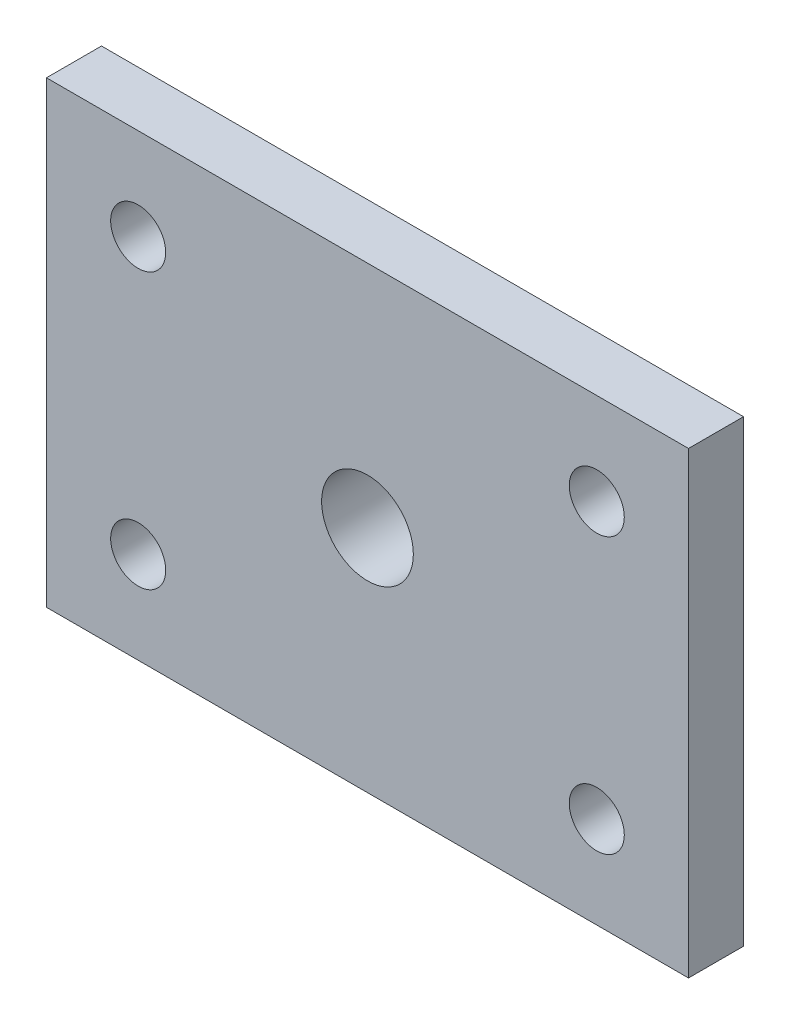
ISO-10303-21;
HEADER;
FILE_DESCRIPTION(('STEP AP214'),'2;1');
FILE_NAME('part.step','',(''),(''),'','','');
FILE_SCHEMA(('AUTOMOTIVE_DESIGN { 1 0 10303 214 1 1 1 1 }'));
ENDSEC;
DATA;
#1=APPLICATION_CONTEXT('core data for automotive mechanical design processes');
#2=APPLICATION_PROTOCOL_DEFINITION('international standard','automotive_design',2000,#1);
#3=PRODUCT_CONTEXT('',#1,'mechanical');
#4=PRODUCT('Part','Part','',(#3));
#5=PRODUCT_RELATED_PRODUCT_CATEGORY('part','',(#4));
#6=PRODUCT_DEFINITION_FORMATION('','',#4);
#7=PRODUCT_DEFINITION_CONTEXT('part definition',#1,'design');
#8=PRODUCT_DEFINITION('design','',#6,#7);
#9=PRODUCT_DEFINITION_SHAPE('','',#8);
#10=(LENGTH_UNIT() NAMED_UNIT(*) SI_UNIT(.MILLI.,.METRE.));
#11=(NAMED_UNIT(*) PLANE_ANGLE_UNIT() SI_UNIT($,.RADIAN.));
#12=(NAMED_UNIT(*) SI_UNIT($,.STERADIAN.) SOLID_ANGLE_UNIT());
#13=UNCERTAINTY_MEASURE_WITH_UNIT(LENGTH_MEASURE(1.E-05),#10,'distance_accuracy_value','');
#14=(GEOMETRIC_REPRESENTATION_CONTEXT(3) GLOBAL_UNCERTAINTY_ASSIGNED_CONTEXT((#13)) GLOBAL_UNIT_ASSIGNED_CONTEXT((#10,
#11,#12)) REPRESENTATION_CONTEXT('',''));
#15=CARTESIAN_POINT('',(0.,0.,0.));
#16=DIRECTION('',(0.,0.,1.));
#17=DIRECTION('',(1.,0.,0.));
#18=AXIS2_PLACEMENT_3D('',#15,#16,#17);
#19=CARTESIAN_POINT('',(0.,0.,0.));
#20=DIRECTION('',(0.,0.,1.));
#21=DIRECTION('',(1.,0.,0.));
#22=AXIS2_PLACEMENT_3D('',#19,#20,#21);
#23=PLANE('',#22);
#24=DIRECTION('',(0.,1.,0.));
#25=VECTOR('',#24,1.);
#26=CARTESIAN_POINT('',(17.5,12.5,0.));
#27=LINE('',#26,#25);
#28=CARTESIAN_POINT('',(17.5,-12.5,0.));
#29=VERTEX_POINT('',#28);
#30=CARTESIAN_POINT('',(17.5,12.5,0.));
#31=VERTEX_POINT('',#30);
#32=EDGE_CURVE('E102',#29,#31,#27,.T.);
#33=ORIENTED_EDGE('',*,*,#32,.F.);
#34=DIRECTION('',(1.,0.,0.));
#35=VECTOR('',#34,1.);
#36=CARTESIAN_POINT('',(-17.5,-12.5,0.));
#37=LINE('',#36,#35);
#38=CARTESIAN_POINT('',(-17.5,-12.5,0.));
#39=VERTEX_POINT('',#38);
#40=EDGE_CURVE('E75',#39,#29,#37,.T.);
#41=ORIENTED_EDGE('',*,*,#40,.F.);
#42=DIRECTION('',(0.,-1.,0.));
#43=VECTOR('',#42,1.);
#44=CARTESIAN_POINT('',(-17.5,12.5,0.));
#45=LINE('',#44,#43);
#46=CARTESIAN_POINT('',(-17.5,12.5,0.));
#47=VERTEX_POINT('',#46);
#48=EDGE_CURVE('E69',#47,#39,#45,.T.);
#49=ORIENTED_EDGE('',*,*,#48,.F.);
#50=DIRECTION('',(-1.,0.,0.));
#51=VECTOR('',#50,1.);
#52=CARTESIAN_POINT('',(-17.5,12.5,0.));
#53=LINE('',#52,#51);
#54=EDGE_CURVE('E93',#31,#47,#53,.T.);
#55=ORIENTED_EDGE('',*,*,#54,.F.);
#56=EDGE_LOOP('',(#33,#41,#49,#55));
#57=FACE_BOUND('',#56,.T.);
#58=CARTESIAN_POINT('',(-12.5,7.5,0.));
#59=DIRECTION('',(0.,0.,1.));
#60=DIRECTION('',(1.,0.,0.));
#61=AXIS2_PLACEMENT_3D('',#58,#59,#60);
#62=CIRCLE('',#61,1.5);
#63=CARTESIAN_POINT('',(-11.,7.5,0.));
#64=VERTEX_POINT('',#63);
#65=EDGE_CURVE('E119',#64,#64,#62,.T.);
#66=ORIENTED_EDGE('',*,*,#65,.T.);
#67=EDGE_LOOP('',(#66));
#68=FACE_BOUND('',#67,.T.);
#69=CARTESIAN_POINT('',(12.5,7.5,0.));
#70=DIRECTION('',(0.,0.,1.));
#71=DIRECTION('',(1.,0.,0.));
#72=AXIS2_PLACEMENT_3D('',#69,#70,#71);
#73=CIRCLE('',#72,1.5);
#74=CARTESIAN_POINT('',(14.,7.5,0.));
#75=VERTEX_POINT('',#74);
#76=EDGE_CURVE('E123',#75,#75,#73,.T.);
#77=ORIENTED_EDGE('',*,*,#76,.T.);
#78=EDGE_LOOP('',(#77));
#79=FACE_BOUND('',#78,.T.);
#80=CARTESIAN_POINT('',(12.5,-7.50000000000001,0.));
#81=DIRECTION('',(0.,0.,1.));
#82=DIRECTION('',(1.,0.,0.));
#83=AXIS2_PLACEMENT_3D('',#80,#81,#82);
#84=CIRCLE('',#83,1.5);
#85=CARTESIAN_POINT('',(14.,-7.50000000000001,0.));
#86=VERTEX_POINT('',#85);
#87=EDGE_CURVE('E127',#86,#86,#84,.T.);
#88=ORIENTED_EDGE('',*,*,#87,.T.);
#89=EDGE_LOOP('',(#88));
#90=FACE_BOUND('',#89,.T.);
#91=CARTESIAN_POINT('',(-12.5,-7.50000000000001,0.));
#92=DIRECTION('',(0.,0.,1.));
#93=DIRECTION('',(1.,0.,0.));
#94=AXIS2_PLACEMENT_3D('',#91,#92,#93);
#95=CIRCLE('',#94,1.5);
#96=CARTESIAN_POINT('',(-11.,-7.50000000000001,0.));
#97=VERTEX_POINT('',#96);
#98=EDGE_CURVE('E131',#97,#97,#95,.T.);
#99=ORIENTED_EDGE('',*,*,#98,.T.);
#100=EDGE_LOOP('',(#99));
#101=FACE_BOUND('',#100,.T.);
#102=CARTESIAN_POINT('',(0.,0.,0.));
#103=DIRECTION('',(0.,0.,1.));
#104=DIRECTION('',(1.,0.,0.));
#105=AXIS2_PLACEMENT_3D('',#102,#103,#104);
#106=CIRCLE('',#105,7.5);
#107=CARTESIAN_POINT('',(7.5,0.,0.));
#108=VERTEX_POINT('',#107);
#109=EDGE_CURVE('E11',#108,#108,#106,.F.);
#110=ORIENTED_EDGE('',*,*,#109,.F.);
#111=EDGE_LOOP('',(#110));
#112=FACE_BOUND('',#111,.T.);
#113=ADVANCED_FACE('F35',(#57,#68,#79,#90,#101,#112),#23,.F.);
#114=CARTESIAN_POINT('',(17.5,12.5,3.));
#115=DIRECTION('',(-1.,0.,0.));
#116=DIRECTION('',(0.,-1.,0.));
#117=AXIS2_PLACEMENT_3D('',#114,#115,#116);
#118=PLANE('',#117);
#119=ORIENTED_EDGE('',*,*,#32,.T.);
#120=DIRECTION('',(0.,0.,-1.));
#121=VECTOR('',#120,1.);
#122=CARTESIAN_POINT('',(17.5,12.5,3.));
#123=LINE('',#122,#121);
#124=CARTESIAN_POINT('',(17.5,12.5,3.));
#125=VERTEX_POINT('',#124);
#126=EDGE_CURVE('E44',#125,#31,#123,.T.);
#127=ORIENTED_EDGE('',*,*,#126,.F.);
#128=DIRECTION('',(0.,1.,0.));
#129=VECTOR('',#128,1.);
#130=CARTESIAN_POINT('',(17.5,12.5,3.));
#131=LINE('',#130,#129);
#132=CARTESIAN_POINT('',(17.5,-12.5,3.));
#133=VERTEX_POINT('',#132);
#134=EDGE_CURVE('E88',#133,#125,#131,.T.);
#135=ORIENTED_EDGE('',*,*,#134,.F.);
#136=DIRECTION('',(0.,0.,-1.));
#137=VECTOR('',#136,1.);
#138=CARTESIAN_POINT('',(17.5,-12.5,3.));
#139=LINE('',#138,#137);
#140=EDGE_CURVE('E98',#133,#29,#139,.T.);
#141=ORIENTED_EDGE('',*,*,#140,.T.);
#142=EDGE_LOOP('',(#119,#127,#135,#141));
#143=FACE_BOUND('',#142,.T.);
#144=ADVANCED_FACE('F37',(#143),#118,.F.);
#145=CARTESIAN_POINT('',(-17.5,12.5,3.));
#146=DIRECTION('',(0.,-1.,0.));
#147=DIRECTION('',(0.,0.,-1.));
#148=AXIS2_PLACEMENT_3D('',#145,#146,#147);
#149=PLANE('',#148);
#150=ORIENTED_EDGE('',*,*,#54,.T.);
#151=DIRECTION('',(0.,0.,-1.));
#152=VECTOR('',#151,1.);
#153=CARTESIAN_POINT('',(-17.5,12.5,3.));
#154=LINE('',#153,#152);
#155=CARTESIAN_POINT('',(-17.5,12.5,3.));
#156=VERTEX_POINT('',#155);
#157=EDGE_CURVE('E91',#156,#47,#154,.T.);
#158=ORIENTED_EDGE('',*,*,#157,.F.);
#159=DIRECTION('',(-1.,0.,0.));
#160=VECTOR('',#159,1.);
#161=CARTESIAN_POINT('',(-17.5,12.5,3.));
#162=LINE('',#161,#160);
#163=EDGE_CURVE('E83',#125,#156,#162,.T.);
#164=ORIENTED_EDGE('',*,*,#163,.F.);
#165=ORIENTED_EDGE('',*,*,#126,.T.);
#166=EDGE_LOOP('',(#150,#158,#164,#165));
#167=FACE_BOUND('',#166,.T.);
#168=ADVANCED_FACE('F92',(#167),#149,.F.);
#169=CARTESIAN_POINT('',(-17.5,12.5,3.));
#170=DIRECTION('',(1.,0.,0.));
#171=DIRECTION('',(0.,1.,0.));
#172=AXIS2_PLACEMENT_3D('',#169,#170,#171);
#173=PLANE('',#172);
#174=ORIENTED_EDGE('',*,*,#48,.T.);
#175=DIRECTION('',(0.,0.,-1.));
#176=VECTOR('',#175,1.);
#177=CARTESIAN_POINT('',(-17.5,-12.5,3.));
#178=LINE('',#177,#176);
#179=CARTESIAN_POINT('',(-17.5,-12.5,3.));
#180=VERTEX_POINT('',#179);
#181=EDGE_CURVE('E94',#180,#39,#178,.T.);
#182=ORIENTED_EDGE('',*,*,#181,.F.);
#183=DIRECTION('',(0.,-1.,0.));
#184=VECTOR('',#183,1.);
#185=CARTESIAN_POINT('',(-17.5,12.5,3.));
#186=LINE('',#185,#184);
#187=EDGE_CURVE('E86',#156,#180,#186,.T.);
#188=ORIENTED_EDGE('',*,*,#187,.F.);
#189=ORIENTED_EDGE('',*,*,#157,.T.);
#190=EDGE_LOOP('',(#174,#182,#188,#189));
#191=FACE_BOUND('',#190,.T.);
#192=ADVANCED_FACE('F96',(#191),#173,.F.);
#193=CARTESIAN_POINT('',(-17.5,-12.5,3.));
#194=DIRECTION('',(0.,1.,0.));
#195=DIRECTION('',(0.,0.,1.));
#196=AXIS2_PLACEMENT_3D('',#193,#194,#195);
#197=PLANE('',#196);
#198=ORIENTED_EDGE('',*,*,#40,.T.);
#199=ORIENTED_EDGE('',*,*,#140,.F.);
#200=DIRECTION('',(1.,0.,0.));
#201=VECTOR('',#200,1.);
#202=CARTESIAN_POINT('',(-17.5,-12.5,3.));
#203=LINE('',#202,#201);
#204=EDGE_CURVE('E52',#180,#133,#203,.T.);
#205=ORIENTED_EDGE('',*,*,#204,.F.);
#206=ORIENTED_EDGE('',*,*,#181,.T.);
#207=EDGE_LOOP('',(#198,#199,#205,#206));
#208=FACE_BOUND('',#207,.T.);
#209=ADVANCED_FACE('F167',(#208),#197,.F.);
#210=CARTESIAN_POINT('',(0.,0.,3.));
#211=DIRECTION('',(0.,0.,1.));
#212=DIRECTION('',(1.,0.,0.));
#213=AXIS2_PLACEMENT_3D('',#210,#211,#212);
#214=PLANE('',#213);
#215=CARTESIAN_POINT('',(-12.5,-7.50000000000001,3.));
#216=DIRECTION('',(0.,0.,1.));
#217=DIRECTION('',(1.,0.,0.));
#218=AXIS2_PLACEMENT_3D('',#215,#216,#217);
#219=CIRCLE('',#218,1.5);
#220=CARTESIAN_POINT('',(-11.,-7.50000000000001,3.));
#221=VERTEX_POINT('',#220);
#222=EDGE_CURVE('E257',#221,#221,#219,.T.);
#223=ORIENTED_EDGE('',*,*,#222,.F.);
#224=EDGE_LOOP('',(#223));
#225=FACE_BOUND('',#224,.T.);
#226=CARTESIAN_POINT('',(12.5,-7.50000000000001,3.));
#227=DIRECTION('',(0.,0.,1.));
#228=DIRECTION('',(1.,0.,0.));
#229=AXIS2_PLACEMENT_3D('',#226,#227,#228);
#230=CIRCLE('',#229,1.5);
#231=CARTESIAN_POINT('',(14.,-7.50000000000001,3.));
#232=VERTEX_POINT('',#231);
#233=EDGE_CURVE('E261',#232,#232,#230,.T.);
#234=ORIENTED_EDGE('',*,*,#233,.F.);
#235=EDGE_LOOP('',(#234));
#236=FACE_BOUND('',#235,.T.);
#237=CARTESIAN_POINT('',(12.5,7.5,3.));
#238=DIRECTION('',(0.,0.,1.));
#239=DIRECTION('',(1.,0.,0.));
#240=AXIS2_PLACEMENT_3D('',#237,#238,#239);
#241=CIRCLE('',#240,1.5);
#242=CARTESIAN_POINT('',(14.,7.5,3.));
#243=VERTEX_POINT('',#242);
#244=EDGE_CURVE('E265',#243,#243,#241,.T.);
#245=ORIENTED_EDGE('',*,*,#244,.F.);
#246=EDGE_LOOP('',(#245));
#247=FACE_BOUND('',#246,.T.);
#248=CARTESIAN_POINT('',(-12.5,7.5,3.));
#249=DIRECTION('',(0.,0.,1.));
#250=DIRECTION('',(1.,0.,0.));
#251=AXIS2_PLACEMENT_3D('',#248,#249,#250);
#252=CIRCLE('',#251,1.5);
#253=CARTESIAN_POINT('',(-11.,7.5,3.));
#254=VERTEX_POINT('',#253);
#255=EDGE_CURVE('E269',#254,#254,#252,.T.);
#256=ORIENTED_EDGE('',*,*,#255,.F.);
#257=EDGE_LOOP('',(#256));
#258=FACE_BOUND('',#257,.T.);
#259=CARTESIAN_POINT('',(0.,0.,3.));
#260=DIRECTION('',(0.,0.,1.));
#261=DIRECTION('',(1.,0.,0.));
#262=AXIS2_PLACEMENT_3D('',#259,#260,#261);
#263=CIRCLE('',#262,2.5);
#264=CARTESIAN_POINT('',(2.5,0.,3.));
#265=VERTEX_POINT('',#264);
#266=EDGE_CURVE('E105',#265,#265,#263,.T.);
#267=ORIENTED_EDGE('',*,*,#266,.F.);
#268=EDGE_LOOP('',(#267));
#269=FACE_BOUND('',#268,.T.);
#270=ORIENTED_EDGE('',*,*,#134,.T.);
#271=ORIENTED_EDGE('',*,*,#163,.T.);
#272=ORIENTED_EDGE('',*,*,#187,.T.);
#273=ORIENTED_EDGE('',*,*,#204,.T.);
#274=EDGE_LOOP('',(#270,#271,#272,#273));
#275=FACE_BOUND('',#274,.T.);
#276=ADVANCED_FACE('F84',(#225,#236,#247,#258,#269,#275),#214,.T.);
#277=CARTESIAN_POINT('',(0.,0.,0.));
#278=DIRECTION('',(0.,0.,1.));
#279=DIRECTION('',(1.,0.,0.));
#280=AXIS2_PLACEMENT_3D('',#277,#278,#279);
#281=CYLINDRICAL_SURFACE('',#280,2.5);
#282=ORIENTED_EDGE('',*,*,#266,.T.);
#283=EDGE_LOOP('',(#282));
#284=FACE_BOUND('',#283,.T.);
#285=CARTESIAN_POINT('',(0.,0.,-5.));
#286=DIRECTION('',(0.,0.,-1.));
#287=DIRECTION('',(-1.,0.,0.));
#288=AXIS2_PLACEMENT_3D('',#285,#286,#287);
#289=CIRCLE('',#288,2.5);
#290=CARTESIAN_POINT('',(-2.5,0.,-5.));
#291=VERTEX_POINT('',#290);
#292=EDGE_CURVE('E285',#291,#291,#289,.T.);
#293=ORIENTED_EDGE('',*,*,#292,.T.);
#294=EDGE_LOOP('',(#293));
#295=FACE_BOUND('',#294,.T.);
#296=ADVANCED_FACE('F161',(#284,#295),#281,.F.);
#297=CARTESIAN_POINT('',(-12.5,7.5,0.));
#298=DIRECTION('',(0.,0.,1.));
#299=DIRECTION('',(1.,0.,0.));
#300=AXIS2_PLACEMENT_3D('',#297,#298,#299);
#301=CYLINDRICAL_SURFACE('',#300,1.5);
#302=ORIENTED_EDGE('',*,*,#65,.F.);
#303=EDGE_LOOP('',(#302));
#304=FACE_BOUND('',#303,.T.);
#305=ORIENTED_EDGE('',*,*,#255,.T.);
#306=EDGE_LOOP('',(#305));
#307=FACE_BOUND('',#306,.T.);
#308=ADVANCED_FACE('F157',(#304,#307),#301,.F.);
#309=CARTESIAN_POINT('',(12.5,7.5,0.));
#310=DIRECTION('',(0.,0.,1.));
#311=DIRECTION('',(1.,0.,0.));
#312=AXIS2_PLACEMENT_3D('',#309,#310,#311);
#313=CYLINDRICAL_SURFACE('',#312,1.5);
#314=ORIENTED_EDGE('',*,*,#76,.F.);
#315=EDGE_LOOP('',(#314));
#316=FACE_BOUND('',#315,.T.);
#317=ORIENTED_EDGE('',*,*,#244,.T.);
#318=EDGE_LOOP('',(#317));
#319=FACE_BOUND('',#318,.T.);
#320=ADVANCED_FACE('F153',(#316,#319),#313,.F.);
#321=CARTESIAN_POINT('',(12.5,-7.50000000000001,0.));
#322=DIRECTION('',(0.,0.,1.));
#323=DIRECTION('',(1.,0.,0.));
#324=AXIS2_PLACEMENT_3D('',#321,#322,#323);
#325=CYLINDRICAL_SURFACE('',#324,1.5);
#326=ORIENTED_EDGE('',*,*,#87,.F.);
#327=EDGE_LOOP('',(#326));
#328=FACE_BOUND('',#327,.T.);
#329=ORIENTED_EDGE('',*,*,#233,.T.);
#330=EDGE_LOOP('',(#329));
#331=FACE_BOUND('',#330,.T.);
#332=ADVANCED_FACE('F149',(#328,#331),#325,.F.);
#333=CARTESIAN_POINT('',(-12.5,-7.50000000000001,0.));
#334=DIRECTION('',(0.,0.,1.));
#335=DIRECTION('',(1.,0.,0.));
#336=AXIS2_PLACEMENT_3D('',#333,#334,#335);
#337=CYLINDRICAL_SURFACE('',#336,1.5);
#338=ORIENTED_EDGE('',*,*,#98,.F.);
#339=EDGE_LOOP('',(#338));
#340=FACE_BOUND('',#339,.T.);
#341=ORIENTED_EDGE('',*,*,#222,.T.);
#342=EDGE_LOOP('',(#341));
#343=FACE_BOUND('',#342,.T.);
#344=ADVANCED_FACE('F142',(#340,#343),#337,.F.);
#345=CARTESIAN_POINT('',(0.,0.,-5.));
#346=DIRECTION('',(0.,0.,-1.));
#347=DIRECTION('',(-1.,0.,0.));
#348=AXIS2_PLACEMENT_3D('',#345,#346,#347);
#349=PLANE('',#348);
#350=CARTESIAN_POINT('',(0.,0.,-5.));
#351=DIRECTION('',(0.,0.,-1.));
#352=DIRECTION('',(-1.,0.,0.));
#353=AXIS2_PLACEMENT_3D('',#350,#351,#352);
#354=CIRCLE('',#353,7.5);
#355=CARTESIAN_POINT('',(-7.5,0.,-5.));
#356=VERTEX_POINT('',#355);
#357=EDGE_CURVE('E281',#356,#356,#354,.T.);
#358=ORIENTED_EDGE('',*,*,#357,.T.);
#359=EDGE_LOOP('',(#358));
#360=FACE_BOUND('',#359,.T.);
#361=ORIENTED_EDGE('',*,*,#292,.F.);
#362=EDGE_LOOP('',(#361));
#363=FACE_BOUND('',#362,.T.);
#364=ADVANCED_FACE('F136',(#360,#363),#349,.T.);
#365=CARTESIAN_POINT('',(0.,0.,-5.));
#366=DIRECTION('',(0.,0.,1.));
#367=DIRECTION('',(1.,0.,0.));
#368=AXIS2_PLACEMENT_3D('',#365,#366,#367);
#369=CYLINDRICAL_SURFACE('',#368,7.5);
#370=ORIENTED_EDGE('',*,*,#357,.F.);
#371=EDGE_LOOP('',(#370));
#372=FACE_BOUND('',#371,.T.);
#373=ORIENTED_EDGE('',*,*,#109,.T.);
#374=EDGE_LOOP('',(#373));
#375=FACE_BOUND('',#374,.T.);
#376=ADVANCED_FACE('F134',(#372,#375),#369,.T.);
#377=CLOSED_SHELL('',(#113,#144,#168,#192,#209,#276,#296,#308,#320,#332,#344,#364,#376));
#378=MANIFOLD_SOLID_BREP('B2',#377);
#379=ADVANCED_BREP_SHAPE_REPRESENTATION('',(#18,#378),#14);
#380=SHAPE_DEFINITION_REPRESENTATION(#9,#379);
ENDSEC;
END-ISO-10303-21;
